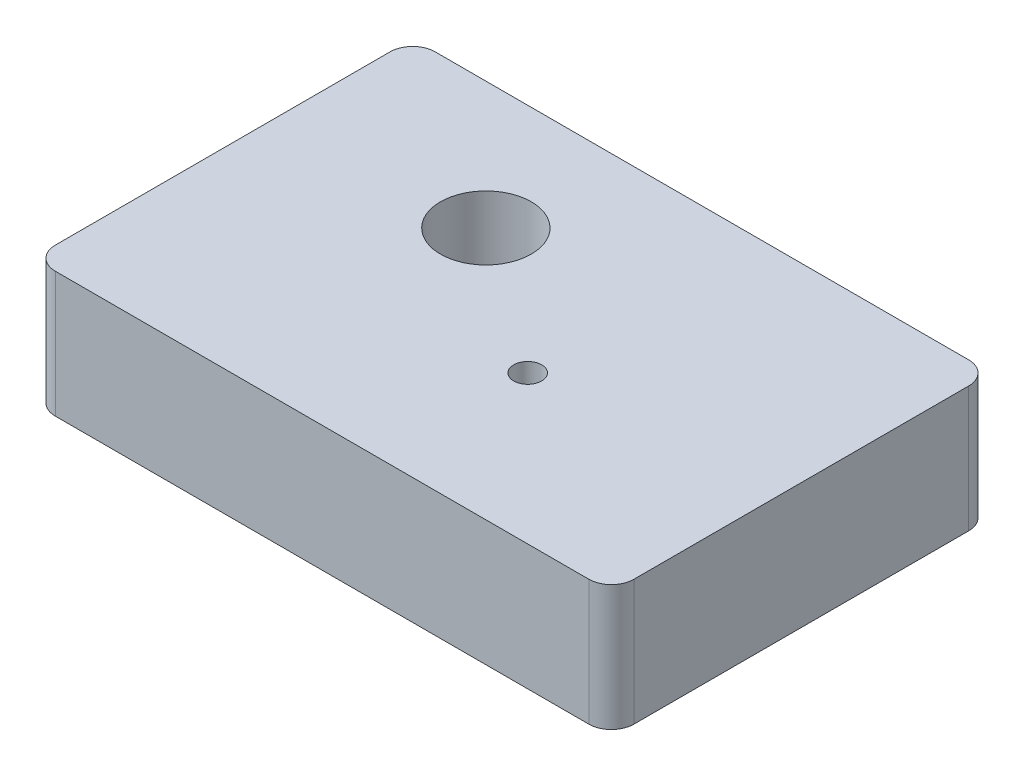
ISO-10303-21;
HEADER;
FILE_DESCRIPTION(('STEP AP214'),'2;1');
FILE_NAME('part.step','',(''),(''),'','','');
FILE_SCHEMA(('AUTOMOTIVE_DESIGN { 1 0 10303 214 1 1 1 1 }'));
ENDSEC;
DATA;
#1=APPLICATION_CONTEXT('core data for automotive mechanical design processes');
#2=APPLICATION_PROTOCOL_DEFINITION('international standard','automotive_design',2000,#1);
#3=PRODUCT_CONTEXT('',#1,'mechanical');
#4=PRODUCT('Part','Part','',(#3));
#5=PRODUCT_RELATED_PRODUCT_CATEGORY('part','',(#4));
#6=PRODUCT_DEFINITION_FORMATION('','',#4);
#7=PRODUCT_DEFINITION_CONTEXT('part definition',#1,'design');
#8=PRODUCT_DEFINITION('design','',#6,#7);
#9=PRODUCT_DEFINITION_SHAPE('','',#8);
#10=(LENGTH_UNIT() NAMED_UNIT(*) SI_UNIT(.MILLI.,.METRE.));
#11=(NAMED_UNIT(*) PLANE_ANGLE_UNIT() SI_UNIT($,.RADIAN.));
#12=(NAMED_UNIT(*) SI_UNIT($,.STERADIAN.) SOLID_ANGLE_UNIT());
#13=UNCERTAINTY_MEASURE_WITH_UNIT(LENGTH_MEASURE(1.E-05),#10,'distance_accuracy_value','');
#14=(GEOMETRIC_REPRESENTATION_CONTEXT(3) GLOBAL_UNCERTAINTY_ASSIGNED_CONTEXT((#13)) GLOBAL_UNIT_ASSIGNED_CONTEXT((#10,
#11,#12)) REPRESENTATION_CONTEXT('',''));
#15=CARTESIAN_POINT('',(0.,0.,0.));
#16=DIRECTION('',(0.,0.,1.));
#17=DIRECTION('',(1.,0.,0.));
#18=AXIS2_PLACEMENT_3D('',#15,#16,#17);
#19=CARTESIAN_POINT('',(0.,6.,0.));
#20=DIRECTION('',(0.,-1.,0.));
#21=DIRECTION('',(0.,0.,-1.));
#22=AXIS2_PLACEMENT_3D('',#19,#20,#21);
#23=PLANE('',#22);
#24=CARTESIAN_POINT('',(9.5,6.,-12.));
#25=DIRECTION('',(0.,-1.,0.));
#26=DIRECTION('',(0.,0.,-1.));
#27=AXIS2_PLACEMENT_3D('',#24,#25,#26);
#28=CIRCLE('',#27,2.17);
#29=CARTESIAN_POINT('',(9.5,6.,-14.17));
#30=VERTEX_POINT('',#29);
#31=EDGE_CURVE('E128',#30,#30,#28,.F.);
#32=ORIENTED_EDGE('',*,*,#31,.F.);
#33=EDGE_LOOP('',(#32));
#34=FACE_BOUND('',#33,.T.);
#35=DIRECTION('',(0.,0.,1.));
#36=VECTOR('',#35,1.);
#37=CARTESIAN_POINT('',(-0.08,6.,0.));
#38=LINE('',#37,#36);
#39=CARTESIAN_POINT('',(-0.08,6.,-17.));
#40=VERTEX_POINT('',#39);
#41=CARTESIAN_POINT('',(-0.08,6.,-1.));
#42=VERTEX_POINT('',#41);
#43=EDGE_CURVE('E163',#40,#42,#38,.T.);
#44=ORIENTED_EDGE('',*,*,#43,.T.);
#45=CARTESIAN_POINT('',(1.,6.,-1.));
#46=DIRECTION('',(0.,-1.,0.));
#47=DIRECTION('',(0.,0.,-1.));
#48=AXIS2_PLACEMENT_3D('',#45,#46,#47);
#49=CIRCLE('',#48,1.08);
#50=CARTESIAN_POINT('',(1.,6.,0.08));
#51=VERTEX_POINT('',#50);
#52=EDGE_CURVE('E153',#42,#51,#49,.F.);
#53=ORIENTED_EDGE('',*,*,#52,.T.);
#54=DIRECTION('',(1.,0.,0.));
#55=VECTOR('',#54,1.);
#56=CARTESIAN_POINT('',(0.,6.,0.08));
#57=LINE('',#56,#55);
#58=CARTESIAN_POINT('',(26.5,6.,0.08));
#59=VERTEX_POINT('',#58);
#60=EDGE_CURVE('E117',#51,#59,#57,.T.);
#61=ORIENTED_EDGE('',*,*,#60,.T.);
#62=CARTESIAN_POINT('',(26.5,6.,-1.));
#63=DIRECTION('',(0.,-1.,0.));
#64=DIRECTION('',(0.,0.,-1.));
#65=AXIS2_PLACEMENT_3D('',#62,#63,#64);
#66=CIRCLE('',#65,1.08);
#67=CARTESIAN_POINT('',(27.58,6.,-1.));
#68=VERTEX_POINT('',#67);
#69=EDGE_CURVE('E146',#59,#68,#66,.F.);
#70=ORIENTED_EDGE('',*,*,#69,.T.);
#71=DIRECTION('',(0.,0.,-1.));
#72=VECTOR('',#71,1.);
#73=CARTESIAN_POINT('',(27.58,6.,0.));
#74=LINE('',#73,#72);
#75=CARTESIAN_POINT('',(27.58,6.,-17.));
#76=VERTEX_POINT('',#75);
#77=EDGE_CURVE('E162',#68,#76,#74,.T.);
#78=ORIENTED_EDGE('',*,*,#77,.T.);
#79=CARTESIAN_POINT('',(26.5,6.,-17.));
#80=DIRECTION('',(0.,-1.,0.));
#81=DIRECTION('',(0.,0.,-1.));
#82=AXIS2_PLACEMENT_3D('',#79,#80,#81);
#83=CIRCLE('',#82,1.08);
#84=CARTESIAN_POINT('',(26.5,6.,-18.08));
#85=VERTEX_POINT('',#84);
#86=EDGE_CURVE('E166',#76,#85,#83,.F.);
#87=ORIENTED_EDGE('',*,*,#86,.T.);
#88=DIRECTION('',(-1.,0.,0.));
#89=VECTOR('',#88,1.);
#90=CARTESIAN_POINT('',(0.,6.,-18.08));
#91=LINE('',#90,#89);
#92=CARTESIAN_POINT('',(1.,6.,-18.08));
#93=VERTEX_POINT('',#92);
#94=EDGE_CURVE('E158',#85,#93,#91,.T.);
#95=ORIENTED_EDGE('',*,*,#94,.T.);
#96=CARTESIAN_POINT('',(1.,6.,-17.));
#97=DIRECTION('',(0.,-1.,0.));
#98=DIRECTION('',(0.,0.,-1.));
#99=AXIS2_PLACEMENT_3D('',#96,#97,#98);
#100=CIRCLE('',#99,1.08);
#101=EDGE_CURVE('E160',#93,#40,#100,.F.);
#102=ORIENTED_EDGE('',*,*,#101,.T.);
#103=EDGE_LOOP('',(#44,#53,#61,#70,#78,#87,#95,#102));
#104=FACE_BOUND('',#103,.T.);
#105=CARTESIAN_POINT('',(16.5,6.,-7.));
#106=DIRECTION('',(0.,-1.,0.));
#107=DIRECTION('',(0.,0.,-1.));
#108=AXIS2_PLACEMENT_3D('',#105,#106,#107);
#109=CIRCLE('',#108,0.670000000000002);
#110=CARTESIAN_POINT('',(16.5,6.,-7.67));
#111=VERTEX_POINT('',#110);
#112=EDGE_CURVE('E135',#111,#111,#109,.F.);
#113=ORIENTED_EDGE('',*,*,#112,.F.);
#114=EDGE_LOOP('',(#113));
#115=FACE_BOUND('',#114,.T.);
#116=ADVANCED_FACE('F35',(#34,#104,#115),#23,.F.);
#117=CARTESIAN_POINT('',(0.,0.,0.));
#118=DIRECTION('',(0.,-1.,0.));
#119=DIRECTION('',(0.,0.,-1.));
#120=AXIS2_PLACEMENT_3D('',#117,#118,#119);
#121=PLANE('',#120);
#122=CARTESIAN_POINT('',(9.5,0.,-12.));
#123=DIRECTION('',(0.,-1.,0.));
#124=DIRECTION('',(0.,0.,-1.));
#125=AXIS2_PLACEMENT_3D('',#122,#123,#124);
#126=CIRCLE('',#125,2.17);
#127=CARTESIAN_POINT('',(9.5,0.,-14.17));
#128=VERTEX_POINT('',#127);
#129=EDGE_CURVE('E39',#128,#128,#126,.F.);
#130=ORIENTED_EDGE('',*,*,#129,.T.);
#131=EDGE_LOOP('',(#130));
#132=FACE_BOUND('',#131,.T.);
#133=DIRECTION('',(1.,0.,0.));
#134=VECTOR('',#133,1.);
#135=CARTESIAN_POINT('',(0.,0.,0.08));
#136=LINE('',#135,#134);
#137=CARTESIAN_POINT('',(1.,0.,0.08));
#138=VERTEX_POINT('',#137);
#139=CARTESIAN_POINT('',(26.5,0.,0.08));
#140=VERTEX_POINT('',#139);
#141=EDGE_CURVE('E114',#138,#140,#136,.T.);
#142=ORIENTED_EDGE('',*,*,#141,.F.);
#143=CARTESIAN_POINT('',(1.,0.,-1.));
#144=DIRECTION('',(0.,-1.,0.));
#145=DIRECTION('',(0.,0.,-1.));
#146=AXIS2_PLACEMENT_3D('',#143,#144,#145);
#147=CIRCLE('',#146,1.08);
#148=CARTESIAN_POINT('',(-0.08,0.,-1.));
#149=VERTEX_POINT('',#148);
#150=EDGE_CURVE('E100',#138,#149,#147,.T.);
#151=ORIENTED_EDGE('',*,*,#150,.T.);
#152=DIRECTION('',(0.,0.,1.));
#153=VECTOR('',#152,1.);
#154=CARTESIAN_POINT('',(-0.08,0.,0.));
#155=LINE('',#154,#153);
#156=CARTESIAN_POINT('',(-0.08,0.,-17.));
#157=VERTEX_POINT('',#156);
#158=EDGE_CURVE('E123',#157,#149,#155,.T.);
#159=ORIENTED_EDGE('',*,*,#158,.F.);
#160=CARTESIAN_POINT('',(1.,0.,-17.));
#161=DIRECTION('',(0.,-1.,0.));
#162=DIRECTION('',(0.,0.,-1.));
#163=AXIS2_PLACEMENT_3D('',#160,#161,#162);
#164=CIRCLE('',#163,1.08);
#165=CARTESIAN_POINT('',(1.,0.,-18.08));
#166=VERTEX_POINT('',#165);
#167=EDGE_CURVE('E109',#157,#166,#164,.T.);
#168=ORIENTED_EDGE('',*,*,#167,.T.);
#169=DIRECTION('',(-1.,0.,0.));
#170=VECTOR('',#169,1.);
#171=CARTESIAN_POINT('',(0.,0.,-18.08));
#172=LINE('',#171,#170);
#173=CARTESIAN_POINT('',(26.5,0.,-18.08));
#174=VERTEX_POINT('',#173);
#175=EDGE_CURVE('E126',#174,#166,#172,.T.);
#176=ORIENTED_EDGE('',*,*,#175,.F.);
#177=CARTESIAN_POINT('',(26.5,0.,-17.));
#178=DIRECTION('',(0.,-1.,0.));
#179=DIRECTION('',(0.,0.,-1.));
#180=AXIS2_PLACEMENT_3D('',#177,#178,#179);
#181=CIRCLE('',#180,1.08);
#182=CARTESIAN_POINT('',(27.58,0.,-17.));
#183=VERTEX_POINT('',#182);
#184=EDGE_CURVE('E175',#174,#183,#181,.T.);
#185=ORIENTED_EDGE('',*,*,#184,.T.);
#186=DIRECTION('',(0.,0.,-1.));
#187=VECTOR('',#186,1.);
#188=CARTESIAN_POINT('',(27.58,0.,0.));
#189=LINE('',#188,#187);
#190=CARTESIAN_POINT('',(27.58,0.,-1.));
#191=VERTEX_POINT('',#190);
#192=EDGE_CURVE('E122',#191,#183,#189,.T.);
#193=ORIENTED_EDGE('',*,*,#192,.F.);
#194=CARTESIAN_POINT('',(26.5,0.,-1.));
#195=DIRECTION('',(0.,-1.,0.));
#196=DIRECTION('',(0.,0.,-1.));
#197=AXIS2_PLACEMENT_3D('',#194,#195,#196);
#198=CIRCLE('',#197,1.08);
#199=EDGE_CURVE('E92',#191,#140,#198,.T.);
#200=ORIENTED_EDGE('',*,*,#199,.T.);
#201=EDGE_LOOP('',(#142,#151,#159,#168,#176,#185,#193,#200));
#202=FACE_BOUND('',#201,.T.);
#203=CARTESIAN_POINT('',(16.5,0.,-7.));
#204=DIRECTION('',(0.,-1.,0.));
#205=DIRECTION('',(0.,0.,-1.));
#206=AXIS2_PLACEMENT_3D('',#203,#204,#205);
#207=CIRCLE('',#206,0.670000000000002);
#208=CARTESIAN_POINT('',(16.5,0.,-7.67));
#209=VERTEX_POINT('',#208);
#210=EDGE_CURVE('E139',#209,#209,#207,.F.);
#211=ORIENTED_EDGE('',*,*,#210,.T.);
#212=EDGE_LOOP('',(#211));
#213=FACE_BOUND('',#212,.T.);
#214=ADVANCED_FACE('F120',(#132,#202,#213),#121,.T.);
#215=CARTESIAN_POINT('',(-0.08,6.,0.));
#216=DIRECTION('',(1.,0.,0.));
#217=DIRECTION('',(0.,0.,-1.));
#218=AXIS2_PLACEMENT_3D('',#215,#216,#217);
#219=PLANE('',#218);
#220=ORIENTED_EDGE('',*,*,#158,.T.);
#221=DIRECTION('',(0.,1.,0.));
#222=VECTOR('',#221,1.);
#223=CARTESIAN_POINT('',(-0.08,6.,-1.));
#224=LINE('',#223,#222);
#225=EDGE_CURVE('E105',#149,#42,#224,.T.);
#226=ORIENTED_EDGE('',*,*,#225,.T.);
#227=ORIENTED_EDGE('',*,*,#43,.F.);
#228=DIRECTION('',(0.,1.,0.));
#229=VECTOR('',#228,1.);
#230=CARTESIAN_POINT('',(-0.08,6.,-17.));
#231=LINE('',#230,#229);
#232=EDGE_CURVE('E108',#40,#157,#231,.F.);
#233=ORIENTED_EDGE('',*,*,#232,.T.);
#234=EDGE_LOOP('',(#220,#226,#227,#233));
#235=FACE_BOUND('',#234,.T.);
#236=ADVANCED_FACE('F196',(#235),#219,.F.);
#237=CARTESIAN_POINT('',(0.,6.,0.08));
#238=DIRECTION('',(0.,0.,-1.));
#239=DIRECTION('',(-1.,0.,0.));
#240=AXIS2_PLACEMENT_3D('',#237,#238,#239);
#241=PLANE('',#240);
#242=ORIENTED_EDGE('',*,*,#60,.F.);
#243=DIRECTION('',(0.,1.,0.));
#244=VECTOR('',#243,1.);
#245=CARTESIAN_POINT('',(1.,6.,0.08));
#246=LINE('',#245,#244);
#247=EDGE_CURVE('E104',#51,#138,#246,.F.);
#248=ORIENTED_EDGE('',*,*,#247,.T.);
#249=ORIENTED_EDGE('',*,*,#141,.T.);
#250=DIRECTION('',(0.,1.,0.));
#251=VECTOR('',#250,1.);
#252=CARTESIAN_POINT('',(26.5,6.,0.08));
#253=LINE('',#252,#251);
#254=EDGE_CURVE('E118',#140,#59,#253,.T.);
#255=ORIENTED_EDGE('',*,*,#254,.T.);
#256=EDGE_LOOP('',(#242,#248,#249,#255));
#257=FACE_BOUND('',#256,.T.);
#258=ADVANCED_FACE('F37',(#257),#241,.F.);
#259=CARTESIAN_POINT('',(27.58,6.,0.));
#260=DIRECTION('',(-1.,0.,0.));
#261=DIRECTION('',(0.,0.,1.));
#262=AXIS2_PLACEMENT_3D('',#259,#260,#261);
#263=PLANE('',#262);
#264=ORIENTED_EDGE('',*,*,#192,.T.);
#265=DIRECTION('',(0.,1.,0.));
#266=VECTOR('',#265,1.);
#267=CARTESIAN_POINT('',(27.58,6.,-17.));
#268=LINE('',#267,#266);
#269=EDGE_CURVE('E12',#183,#76,#268,.T.);
#270=ORIENTED_EDGE('',*,*,#269,.T.);
#271=ORIENTED_EDGE('',*,*,#77,.F.);
#272=DIRECTION('',(0.,1.,0.));
#273=VECTOR('',#272,1.);
#274=CARTESIAN_POINT('',(27.58,6.,-1.));
#275=LINE('',#274,#273);
#276=EDGE_CURVE('E45',#68,#191,#275,.F.);
#277=ORIENTED_EDGE('',*,*,#276,.T.);
#278=EDGE_LOOP('',(#264,#270,#271,#277));
#279=FACE_BOUND('',#278,.T.);
#280=ADVANCED_FACE('F182',(#279),#263,.F.);
#281=CARTESIAN_POINT('',(0.,6.,-18.08));
#282=DIRECTION('',(0.,0.,1.));
#283=DIRECTION('',(1.,0.,0.));
#284=AXIS2_PLACEMENT_3D('',#281,#282,#283);
#285=PLANE('',#284);
#286=ORIENTED_EDGE('',*,*,#175,.T.);
#287=DIRECTION('',(0.,1.,0.));
#288=VECTOR('',#287,1.);
#289=CARTESIAN_POINT('',(1.,6.,-18.08));
#290=LINE('',#289,#288);
#291=EDGE_CURVE('E54',#166,#93,#290,.T.);
#292=ORIENTED_EDGE('',*,*,#291,.T.);
#293=ORIENTED_EDGE('',*,*,#94,.F.);
#294=DIRECTION('',(0.,1.,0.));
#295=VECTOR('',#294,1.);
#296=CARTESIAN_POINT('',(26.5,6.,-18.08));
#297=LINE('',#296,#295);
#298=EDGE_CURVE('E151',#85,#174,#297,.F.);
#299=ORIENTED_EDGE('',*,*,#298,.T.);
#300=EDGE_LOOP('',(#286,#292,#293,#299));
#301=FACE_BOUND('',#300,.T.);
#302=ADVANCED_FACE('F190',(#301),#285,.F.);
#303=CARTESIAN_POINT('',(9.5,6.,-12.));
#304=DIRECTION('',(0.,-1.,0.));
#305=DIRECTION('',(0.,0.,-1.));
#306=AXIS2_PLACEMENT_3D('',#303,#304,#305);
#307=CYLINDRICAL_SURFACE('',#306,2.17);
#308=ORIENTED_EDGE('',*,*,#31,.T.);
#309=EDGE_LOOP('',(#308));
#310=FACE_BOUND('',#309,.T.);
#311=ORIENTED_EDGE('',*,*,#129,.F.);
#312=EDGE_LOOP('',(#311));
#313=FACE_BOUND('',#312,.T.);
#314=ADVANCED_FACE('F215',(#310,#313),#307,.F.);
#315=CARTESIAN_POINT('',(16.5,6.,-7.));
#316=DIRECTION('',(0.,-1.,0.));
#317=DIRECTION('',(0.,0.,-1.));
#318=AXIS2_PLACEMENT_3D('',#315,#316,#317);
#319=CYLINDRICAL_SURFACE('',#318,0.670000000000002);
#320=ORIENTED_EDGE('',*,*,#112,.T.);
#321=EDGE_LOOP('',(#320));
#322=FACE_BOUND('',#321,.T.);
#323=ORIENTED_EDGE('',*,*,#210,.F.);
#324=EDGE_LOOP('',(#323));
#325=FACE_BOUND('',#324,.T.);
#326=ADVANCED_FACE('F212',(#322,#325),#319,.F.);
#327=CARTESIAN_POINT('',(1.,6.,-1.));
#328=DIRECTION('',(0.,-1.,0.));
#329=DIRECTION('',(0.,0.,-1.));
#330=AXIS2_PLACEMENT_3D('',#327,#328,#329);
#331=CYLINDRICAL_SURFACE('',#330,1.08);
#332=ORIENTED_EDGE('',*,*,#52,.F.);
#333=ORIENTED_EDGE('',*,*,#225,.F.);
#334=ORIENTED_EDGE('',*,*,#150,.F.);
#335=ORIENTED_EDGE('',*,*,#247,.F.);
#336=EDGE_LOOP('',(#332,#333,#334,#335));
#337=FACE_BOUND('',#336,.T.);
#338=ADVANCED_FACE('F103',(#337),#331,.T.);
#339=CARTESIAN_POINT('',(1.,6.,-17.));
#340=DIRECTION('',(0.,-1.,0.));
#341=DIRECTION('',(0.,0.,-1.));
#342=AXIS2_PLACEMENT_3D('',#339,#340,#341);
#343=CYLINDRICAL_SURFACE('',#342,1.08);
#344=ORIENTED_EDGE('',*,*,#101,.F.);
#345=ORIENTED_EDGE('',*,*,#291,.F.);
#346=ORIENTED_EDGE('',*,*,#167,.F.);
#347=ORIENTED_EDGE('',*,*,#232,.F.);
#348=EDGE_LOOP('',(#344,#345,#346,#347));
#349=FACE_BOUND('',#348,.T.);
#350=ADVANCED_FACE('F192',(#349),#343,.T.);
#351=CARTESIAN_POINT('',(26.5,6.,-17.));
#352=DIRECTION('',(0.,-1.,0.));
#353=DIRECTION('',(0.,0.,-1.));
#354=AXIS2_PLACEMENT_3D('',#351,#352,#353);
#355=CYLINDRICAL_SURFACE('',#354,1.08);
#356=ORIENTED_EDGE('',*,*,#86,.F.);
#357=ORIENTED_EDGE('',*,*,#269,.F.);
#358=ORIENTED_EDGE('',*,*,#184,.F.);
#359=ORIENTED_EDGE('',*,*,#298,.F.);
#360=EDGE_LOOP('',(#356,#357,#358,#359));
#361=FACE_BOUND('',#360,.T.);
#362=ADVANCED_FACE('F186',(#361),#355,.T.);
#363=CARTESIAN_POINT('',(26.5,6.,-1.));
#364=DIRECTION('',(0.,-1.,0.));
#365=DIRECTION('',(0.,0.,-1.));
#366=AXIS2_PLACEMENT_3D('',#363,#364,#365);
#367=CYLINDRICAL_SURFACE('',#366,1.08);
#368=ORIENTED_EDGE('',*,*,#69,.F.);
#369=ORIENTED_EDGE('',*,*,#254,.F.);
#370=ORIENTED_EDGE('',*,*,#199,.F.);
#371=ORIENTED_EDGE('',*,*,#276,.F.);
#372=EDGE_LOOP('',(#368,#369,#370,#371));
#373=FACE_BOUND('',#372,.T.);
#374=ADVANCED_FACE('F224',(#373),#367,.T.);
#375=CLOSED_SHELL('',(#116,#214,#236,#258,#280,#302,#314,#326,#338,#350,#362,#374));
#376=MANIFOLD_SOLID_BREP('B2',#375);
#377=ADVANCED_BREP_SHAPE_REPRESENTATION('',(#18,#376),#14);
#378=SHAPE_DEFINITION_REPRESENTATION(#9,#377);
ENDSEC;
END-ISO-10303-21;
